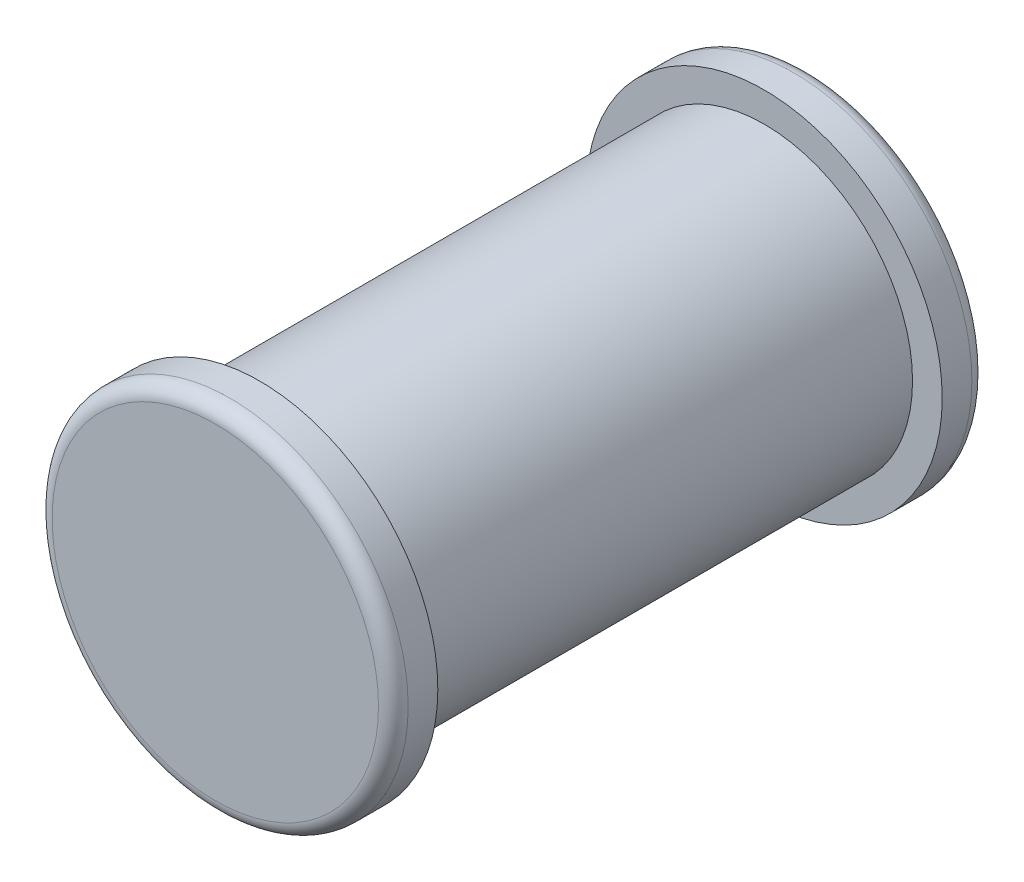
ISO-10303-21;
HEADER;
FILE_DESCRIPTION(('STEP AP214'),'2;1');
FILE_NAME('part.step','',(''),(''),'','','');
FILE_SCHEMA(('AUTOMOTIVE_DESIGN { 1 0 10303 214 1 1 1 1 }'));
ENDSEC;
DATA;
#1=APPLICATION_CONTEXT('core data for automotive mechanical design processes');
#2=APPLICATION_PROTOCOL_DEFINITION('international standard','automotive_design',2000,#1);
#3=PRODUCT_CONTEXT('',#1,'mechanical');
#4=PRODUCT('Part','Part','',(#3));
#5=PRODUCT_RELATED_PRODUCT_CATEGORY('part','',(#4));
#6=PRODUCT_DEFINITION_FORMATION('','',#4);
#7=PRODUCT_DEFINITION_CONTEXT('part definition',#1,'design');
#8=PRODUCT_DEFINITION('design','',#6,#7);
#9=PRODUCT_DEFINITION_SHAPE('','',#8);
#10=(LENGTH_UNIT() NAMED_UNIT(*) SI_UNIT(.MILLI.,.METRE.));
#11=(NAMED_UNIT(*) PLANE_ANGLE_UNIT() SI_UNIT($,.RADIAN.));
#12=(NAMED_UNIT(*) SI_UNIT($,.STERADIAN.) SOLID_ANGLE_UNIT());
#13=UNCERTAINTY_MEASURE_WITH_UNIT(LENGTH_MEASURE(1.E-05),#10,'distance_accuracy_value','');
#14=(GEOMETRIC_REPRESENTATION_CONTEXT(3) GLOBAL_UNCERTAINTY_ASSIGNED_CONTEXT((#13)) GLOBAL_UNIT_ASSIGNED_CONTEXT((#10,
#11,#12)) REPRESENTATION_CONTEXT('',''));
#15=CARTESIAN_POINT('',(0.,0.,0.));
#16=DIRECTION('',(0.,0.,1.));
#17=DIRECTION('',(1.,0.,0.));
#18=AXIS2_PLACEMENT_3D('',#15,#16,#17);
#19=CARTESIAN_POINT('',(0.,0.,40.));
#20=DIRECTION('',(0.,0.,-1.));
#21=DIRECTION('',(-1.,0.,0.));
#22=AXIS2_PLACEMENT_3D('',#19,#20,#21);
#23=CYLINDRICAL_SURFACE('',#22,10.);
#24=CARTESIAN_POINT('',(0.,0.,37.));
#25=DIRECTION('',(0.,0.,1.));
#26=DIRECTION('',(1.,0.,0.));
#27=AXIS2_PLACEMENT_3D('',#24,#25,#26);
#28=CIRCLE('',#27,10.);
#29=CARTESIAN_POINT('',(10.,0.,37.));
#30=VERTEX_POINT('',#29);
#31=EDGE_CURVE('E72',#30,#30,#28,.T.);
#32=ORIENTED_EDGE('',*,*,#31,.F.);
#33=EDGE_LOOP('',(#32));
#34=FACE_BOUND('',#33,.T.);
#35=CARTESIAN_POINT('',(0.,0.,3.));
#36=DIRECTION('',(0.,0.,-1.));
#37=DIRECTION('',(-1.,0.,0.));
#38=AXIS2_PLACEMENT_3D('',#35,#36,#37);
#39=CIRCLE('',#38,10.);
#40=CARTESIAN_POINT('',(-10.,0.,3.));
#41=VERTEX_POINT('',#40);
#42=EDGE_CURVE('E69',#41,#41,#39,.T.);
#43=ORIENTED_EDGE('',*,*,#42,.F.);
#44=EDGE_LOOP('',(#43));
#45=FACE_BOUND('',#44,.T.);
#46=ADVANCED_FACE('F49',(#34,#45),#23,.T.);
#47=CARTESIAN_POINT('',(0.,0.,37.));
#48=DIRECTION('',(0.,0.,1.));
#49=DIRECTION('',(1.,0.,0.));
#50=AXIS2_PLACEMENT_3D('',#47,#48,#49);
#51=CYLINDRICAL_SURFACE('',#50,12.);
#52=CARTESIAN_POINT('',(0.,0.,39.));
#53=DIRECTION('',(0.,0.,1.));
#54=DIRECTION('',(1.,0.,0.));
#55=AXIS2_PLACEMENT_3D('',#52,#53,#54);
#56=CIRCLE('',#55,12.);
#57=CARTESIAN_POINT('',(12.,0.,39.));
#58=VERTEX_POINT('',#57);
#59=EDGE_CURVE('E60',#58,#58,#56,.F.);
#60=ORIENTED_EDGE('',*,*,#59,.T.);
#61=EDGE_LOOP('',(#60));
#62=FACE_BOUND('',#61,.T.);
#63=CARTESIAN_POINT('',(0.,0.,37.));
#64=DIRECTION('',(0.,0.,1.));
#65=DIRECTION('',(1.,0.,0.));
#66=AXIS2_PLACEMENT_3D('',#63,#64,#65);
#67=CIRCLE('',#66,12.);
#68=CARTESIAN_POINT('',(12.,0.,37.));
#69=VERTEX_POINT('',#68);
#70=EDGE_CURVE('E75',#69,#69,#67,.T.);
#71=ORIENTED_EDGE('',*,*,#70,.T.);
#72=EDGE_LOOP('',(#71));
#73=FACE_BOUND('',#72,.T.);
#74=ADVANCED_FACE('F99',(#62,#73),#51,.T.);
#75=CARTESIAN_POINT('',(0.,0.,37.));
#76=DIRECTION('',(0.,0.,1.));
#77=DIRECTION('',(1.,0.,0.));
#78=AXIS2_PLACEMENT_3D('',#75,#76,#77);
#79=PLANE('',#78);
#80=ORIENTED_EDGE('',*,*,#31,.T.);
#81=EDGE_LOOP('',(#80));
#82=FACE_BOUND('',#81,.T.);
#83=ORIENTED_EDGE('',*,*,#70,.F.);
#84=EDGE_LOOP('',(#83));
#85=FACE_BOUND('',#84,.T.);
#86=ADVANCED_FACE('F105',(#82,#85),#79,.F.);
#87=CARTESIAN_POINT('',(0.,0.,40.));
#88=DIRECTION('',(0.,0.,1.));
#89=DIRECTION('',(1.,0.,0.));
#90=AXIS2_PLACEMENT_3D('',#87,#88,#89);
#91=PLANE('',#90);
#92=CARTESIAN_POINT('',(0.,0.,40.));
#93=DIRECTION('',(0.,0.,1.));
#94=DIRECTION('',(1.,0.,0.));
#95=AXIS2_PLACEMENT_3D('',#92,#93,#94);
#96=CIRCLE('',#95,11.);
#97=CARTESIAN_POINT('',(11.,0.,40.));
#98=VERTEX_POINT('',#97);
#99=EDGE_CURVE('E64',#98,#98,#96,.T.);
#100=ORIENTED_EDGE('',*,*,#99,.T.);
#101=EDGE_LOOP('',(#100));
#102=FACE_BOUND('',#101,.T.);
#103=ADVANCED_FACE('F97',(#102),#91,.T.);
#104=CARTESIAN_POINT('',(0.,0.,3.));
#105=DIRECTION('',(0.,0.,-1.));
#106=DIRECTION('',(-1.,0.,0.));
#107=AXIS2_PLACEMENT_3D('',#104,#105,#106);
#108=CYLINDRICAL_SURFACE('',#107,12.);
#109=CARTESIAN_POINT('',(0.,0.,1.));
#110=DIRECTION('',(0.,0.,1.));
#111=DIRECTION('',(1.,0.,0.));
#112=AXIS2_PLACEMENT_3D('',#109,#110,#111);
#113=CIRCLE('',#112,12.);
#114=CARTESIAN_POINT('',(12.,0.,1.));
#115=VERTEX_POINT('',#114);
#116=EDGE_CURVE('E11',#115,#115,#113,.T.);
#117=ORIENTED_EDGE('',*,*,#116,.T.);
#118=EDGE_LOOP('',(#117));
#119=FACE_BOUND('',#118,.T.);
#120=CARTESIAN_POINT('',(0.,0.,3.));
#121=DIRECTION('',(0.,0.,-1.));
#122=DIRECTION('',(-1.,0.,0.));
#123=AXIS2_PLACEMENT_3D('',#120,#121,#122);
#124=CIRCLE('',#123,12.);
#125=CARTESIAN_POINT('',(-12.,0.,3.));
#126=VERTEX_POINT('',#125);
#127=EDGE_CURVE('E78',#126,#126,#124,.T.);
#128=ORIENTED_EDGE('',*,*,#127,.T.);
#129=EDGE_LOOP('',(#128));
#130=FACE_BOUND('',#129,.T.);
#131=ADVANCED_FACE('F82',(#119,#130),#108,.T.);
#132=CARTESIAN_POINT('',(0.,0.,3.));
#133=DIRECTION('',(0.,0.,-1.));
#134=DIRECTION('',(-1.,0.,0.));
#135=AXIS2_PLACEMENT_3D('',#132,#133,#134);
#136=PLANE('',#135);
#137=ORIENTED_EDGE('',*,*,#42,.T.);
#138=EDGE_LOOP('',(#137));
#139=FACE_BOUND('',#138,.T.);
#140=ORIENTED_EDGE('',*,*,#127,.F.);
#141=EDGE_LOOP('',(#140));
#142=FACE_BOUND('',#141,.T.);
#143=ADVANCED_FACE('F84',(#139,#142),#136,.F.);
#144=CARTESIAN_POINT('',(0.,0.,0.));
#145=DIRECTION('',(0.,0.,1.));
#146=DIRECTION('',(1.,0.,0.));
#147=AXIS2_PLACEMENT_3D('',#144,#145,#146);
#148=PLANE('',#147);
#149=CARTESIAN_POINT('',(0.,0.,0.));
#150=DIRECTION('',(0.,0.,1.));
#151=DIRECTION('',(1.,0.,0.));
#152=AXIS2_PLACEMENT_3D('',#149,#150,#151);
#153=CIRCLE('',#152,11.);
#154=CARTESIAN_POINT('',(11.,0.,0.));
#155=VERTEX_POINT('',#154);
#156=EDGE_CURVE('E56',#155,#155,#153,.F.);
#157=ORIENTED_EDGE('',*,*,#156,.T.);
#158=EDGE_LOOP('',(#157));
#159=FACE_BOUND('',#158,.T.);
#160=ADVANCED_FACE('F86',(#159),#148,.F.);
#161=CARTESIAN_POINT('',(0.,0.,39.));
#162=DIRECTION('',(0.,0.,1.));
#163=DIRECTION('',(1.,0.,0.));
#164=AXIS2_PLACEMENT_3D('',#161,#162,#163);
#165=TOROIDAL_SURFACE('',#164,11.,1.);
#166=ORIENTED_EDGE('',*,*,#59,.F.);
#167=EDGE_LOOP('',(#166));
#168=FACE_BOUND('',#167,.T.);
#169=ORIENTED_EDGE('',*,*,#99,.F.);
#170=EDGE_LOOP('',(#169));
#171=FACE_BOUND('',#170,.T.);
#172=ADVANCED_FACE('F94',(#168,#171),#165,.T.);
#173=CARTESIAN_POINT('',(0.,0.,1.));
#174=DIRECTION('',(0.,0.,1.));
#175=DIRECTION('',(1.,0.,0.));
#176=AXIS2_PLACEMENT_3D('',#173,#174,#175);
#177=TOROIDAL_SURFACE('',#176,11.,1.);
#178=ORIENTED_EDGE('',*,*,#116,.F.);
#179=EDGE_LOOP('',(#178));
#180=FACE_BOUND('',#179,.T.);
#181=ORIENTED_EDGE('',*,*,#156,.F.);
#182=EDGE_LOOP('',(#181));
#183=FACE_BOUND('',#182,.T.);
#184=ADVANCED_FACE('F51',(#180,#183),#177,.T.);
#185=CLOSED_SHELL('',(#46,#74,#86,#103,#131,#143,#160,#172,#184));
#186=MANIFOLD_SOLID_BREP('B2',#185);
#187=ADVANCED_BREP_SHAPE_REPRESENTATION('',(#18,#186),#14);
#188=SHAPE_DEFINITION_REPRESENTATION(#9,#187);
ENDSEC;
END-ISO-10303-21;
